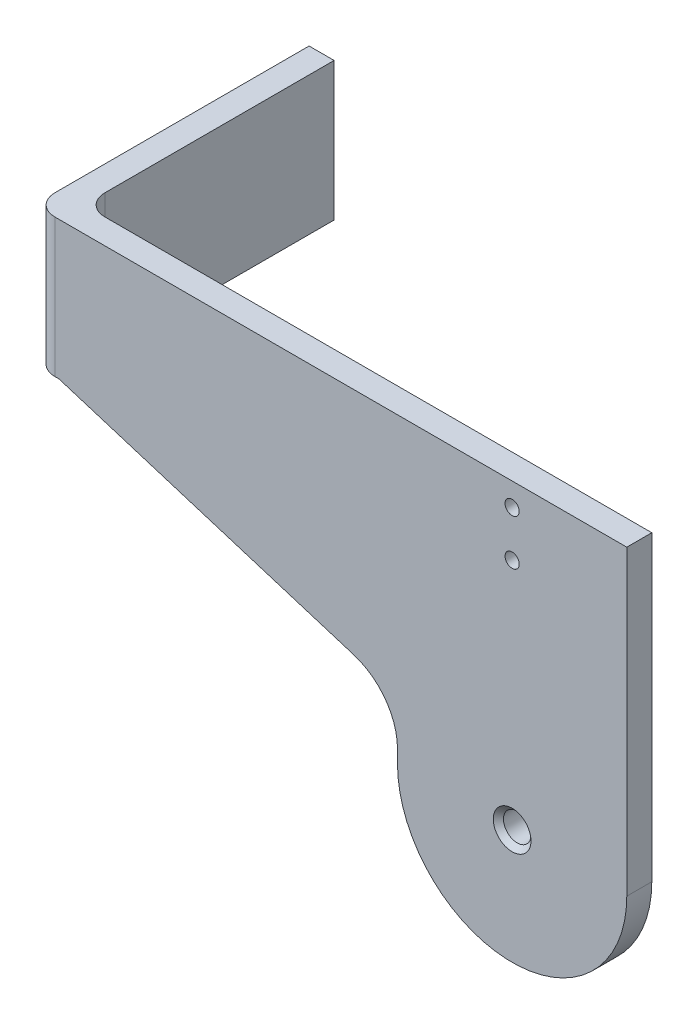
ISO-10303-21;
HEADER;
FILE_DESCRIPTION(('STEP AP214'),'2;1');
FILE_NAME('part.step','',(''),(''),'','','');
FILE_SCHEMA(('AUTOMOTIVE_DESIGN { 1 0 10303 214 1 1 1 1 }'));
ENDSEC;
DATA;
#1=APPLICATION_CONTEXT('core data for automotive mechanical design processes');
#2=APPLICATION_PROTOCOL_DEFINITION('international standard','automotive_design',2000,#1);
#3=PRODUCT_CONTEXT('',#1,'mechanical');
#4=PRODUCT('Part','Part','',(#3));
#5=PRODUCT_RELATED_PRODUCT_CATEGORY('part','',(#4));
#6=PRODUCT_DEFINITION_FORMATION('','',#4);
#7=PRODUCT_DEFINITION_CONTEXT('part definition',#1,'design');
#8=PRODUCT_DEFINITION('design','',#6,#7);
#9=PRODUCT_DEFINITION_SHAPE('','',#8);
#10=(LENGTH_UNIT() NAMED_UNIT(*) SI_UNIT(.MILLI.,.METRE.));
#11=(NAMED_UNIT(*) PLANE_ANGLE_UNIT() SI_UNIT($,.RADIAN.));
#12=(NAMED_UNIT(*) SI_UNIT($,.STERADIAN.) SOLID_ANGLE_UNIT());
#13=UNCERTAINTY_MEASURE_WITH_UNIT(LENGTH_MEASURE(1.E-05),#10,'distance_accuracy_value','');
#14=(GEOMETRIC_REPRESENTATION_CONTEXT(3) GLOBAL_UNCERTAINTY_ASSIGNED_CONTEXT((#13)) GLOBAL_UNIT_ASSIGNED_CONTEXT((#10,
#11,#12)) REPRESENTATION_CONTEXT('',''));
#15=CARTESIAN_POINT('',(0.,0.,0.));
#16=DIRECTION('',(0.,0.,1.));
#17=DIRECTION('',(1.,0.,0.));
#18=AXIS2_PLACEMENT_3D('',#15,#16,#17);
#19=CARTESIAN_POINT('',(-103.7,0.,-5.));
#20=DIRECTION('',(0.,-1.,0.));
#21=DIRECTION('',(0.,0.,-1.));
#22=AXIS2_PLACEMENT_3D('',#19,#20,#21);
#23=CYLINDRICAL_SURFACE('',#22,5.);
#24=DIRECTION('',(0.,1.,0.));
#25=VECTOR('',#24,1.);
#26=CARTESIAN_POINT('',(-103.7,0.,0.));
#27=LINE('',#26,#25);
#28=CARTESIAN_POINT('',(-103.7,37.7951910226967,0.));
#29=VERTEX_POINT('',#28);
#30=CARTESIAN_POINT('',(-103.7,72.5,0.));
#31=VERTEX_POINT('',#30);
#32=EDGE_CURVE('E217',#29,#31,#27,.T.);
#33=ORIENTED_EDGE('',*,*,#32,.F.);
#34=CARTESIAN_POINT('',(-103.7,37.7951910226967,-5.));
#35=DIRECTION('',(0.296450533397002,0.955048208861015,0.));
#36=DIRECTION('',(0.955048208861015,-0.296450533397003,0.));
#37=AXIS2_PLACEMENT_3D('',#34,#35,#36);
#38=ELLIPSE('',#37,5.2353378118608,5.);
#39=CARTESIAN_POINT('',(-108.7,39.3472097095363,-5.));
#40=VERTEX_POINT('',#39);
#41=EDGE_CURVE('E222',#29,#40,#38,.F.);
#42=ORIENTED_EDGE('',*,*,#41,.T.);
#43=DIRECTION('',(0.,1.,0.));
#44=VECTOR('',#43,1.);
#45=CARTESIAN_POINT('',(-108.7,0.,-5.));
#46=LINE('',#45,#44);
#47=CARTESIAN_POINT('',(-108.7,72.5,-5.));
#48=VERTEX_POINT('',#47);
#49=EDGE_CURVE('E220',#48,#40,#46,.F.);
#50=ORIENTED_EDGE('',*,*,#49,.F.);
#51=CARTESIAN_POINT('',(-103.7,72.5,-5.));
#52=DIRECTION('',(0.,-1.,0.));
#53=DIRECTION('',(1.,0.,0.));
#54=AXIS2_PLACEMENT_3D('',#51,#52,#53);
#55=CIRCLE('',#54,5.);
#56=EDGE_CURVE('E132',#48,#31,#55,.F.);
#57=ORIENTED_EDGE('',*,*,#56,.T.);
#58=EDGE_LOOP('',(#33,#42,#50,#57));
#59=FACE_BOUND('',#58,.T.);
#60=ADVANCED_FACE('F42',(#59),#23,.F.);
#61=CARTESIAN_POINT('',(-42.5,3.09246886019721,0.));
#62=DIRECTION('',(0.,0.,-1.));
#63=DIRECTION('',(-1.,0.,0.));
#64=AXIS2_PLACEMENT_3D('',#61,#62,#63);
#65=CYLINDRICAL_SURFACE('',#64,15.);
#66=DIRECTION('',(0.,0.,1.));
#67=VECTOR('',#66,1.);
#68=CARTESIAN_POINT('',(-38.053241999045,17.4181919931124,0.));
#69=LINE('',#68,#67);
#70=CARTESIAN_POINT('',(-38.053241999045,17.4181919931124,0.));
#71=VERTEX_POINT('',#70);
#72=CARTESIAN_POINT('',(-38.053241999045,17.4181919931124,6.));
#73=VERTEX_POINT('',#72);
#74=EDGE_CURVE('E207',#71,#73,#69,.T.);
#75=ORIENTED_EDGE('',*,*,#74,.F.);
#76=CARTESIAN_POINT('',(-42.5,3.09246886019721,0.));
#77=DIRECTION('',(0.,0.,1.));
#78=DIRECTION('',(1.,0.,0.));
#79=AXIS2_PLACEMENT_3D('',#76,#77,#78);
#80=CIRCLE('',#79,15.);
#81=CARTESIAN_POINT('',(-27.5,3.09246886019721,0.));
#82=VERTEX_POINT('',#81);
#83=EDGE_CURVE('E213',#71,#82,#80,.F.);
#84=ORIENTED_EDGE('',*,*,#83,.T.);
#85=DIRECTION('',(0.,0.,1.));
#86=VECTOR('',#85,1.);
#87=CARTESIAN_POINT('',(-27.5,3.09246886019721,0.));
#88=LINE('',#87,#86);
#89=CARTESIAN_POINT('',(-27.5,3.09246886019721,6.));
#90=VERTEX_POINT('',#89);
#91=EDGE_CURVE('E210',#90,#82,#88,.F.);
#92=ORIENTED_EDGE('',*,*,#91,.F.);
#93=CARTESIAN_POINT('',(-42.5,3.09246886019721,6.));
#94=DIRECTION('',(0.,0.,1.));
#95=DIRECTION('',(1.,0.,0.));
#96=AXIS2_PLACEMENT_3D('',#93,#94,#95);
#97=CIRCLE('',#96,15.);
#98=EDGE_CURVE('E215',#90,#73,#97,.T.);
#99=ORIENTED_EDGE('',*,*,#98,.T.);
#100=EDGE_LOOP('',(#75,#84,#92,#99));
#101=FACE_BOUND('',#100,.T.);
#102=ADVANCED_FACE('F250',(#101),#65,.F.);
#103=CARTESIAN_POINT('',(0.,0.,6.));
#104=DIRECTION('',(0.,0.,-1.));
#105=DIRECTION('',(-1.,0.,0.));
#106=AXIS2_PLACEMENT_3D('',#103,#104,#105);
#107=CYLINDRICAL_SURFACE('',#106,27.5);
#108=CARTESIAN_POINT('',(0.,0.,0.));
#109=DIRECTION('',(0.,0.,1.));
#110=DIRECTION('',(1.,0.,0.));
#111=AXIS2_PLACEMENT_3D('',#108,#109,#110);
#112=CIRCLE('',#111,27.5);
#113=CARTESIAN_POINT('',(-27.5,0.,0.));
#114=VERTEX_POINT('',#113);
#115=CARTESIAN_POINT('',(27.5,0.,0.));
#116=VERTEX_POINT('',#115);
#117=EDGE_CURVE('E190',#114,#116,#112,.T.);
#118=ORIENTED_EDGE('',*,*,#117,.T.);
#119=DIRECTION('',(0.,0.,-1.));
#120=VECTOR('',#119,1.);
#121=CARTESIAN_POINT('',(27.5,0.,6.));
#122=LINE('',#121,#120);
#123=CARTESIAN_POINT('',(27.5,0.,6.));
#124=VERTEX_POINT('',#123);
#125=EDGE_CURVE('E204',#124,#116,#122,.T.);
#126=ORIENTED_EDGE('',*,*,#125,.F.);
#127=CARTESIAN_POINT('',(0.,0.,6.));
#128=DIRECTION('',(0.,0.,1.));
#129=DIRECTION('',(1.,0.,0.));
#130=AXIS2_PLACEMENT_3D('',#127,#128,#129);
#131=CIRCLE('',#130,27.5);
#132=CARTESIAN_POINT('',(-27.5,0.,6.));
#133=VERTEX_POINT('',#132);
#134=EDGE_CURVE('E191',#133,#124,#131,.T.);
#135=ORIENTED_EDGE('',*,*,#134,.F.);
#136=DIRECTION('',(0.,0.,-1.));
#137=VECTOR('',#136,1.);
#138=CARTESIAN_POINT('',(-27.5,0.,6.));
#139=LINE('',#138,#137);
#140=EDGE_CURVE('E197',#133,#114,#139,.T.);
#141=ORIENTED_EDGE('',*,*,#140,.T.);
#142=EDGE_LOOP('',(#118,#126,#135,#141));
#143=FACE_BOUND('',#142,.T.);
#144=ADVANCED_FACE('F255',(#143),#107,.T.);
#145=CARTESIAN_POINT('',(27.5,0.,6.));
#146=DIRECTION('',(-1.,0.,0.));
#147=DIRECTION('',(0.,0.,1.));
#148=AXIS2_PLACEMENT_3D('',#145,#146,#147);
#149=PLANE('',#148);
#150=DIRECTION('',(0.,1.,0.));
#151=VECTOR('',#150,1.);
#152=CARTESIAN_POINT('',(27.5,0.,0.));
#153=LINE('',#152,#151);
#154=CARTESIAN_POINT('',(27.5,72.5,0.));
#155=VERTEX_POINT('',#154);
#156=EDGE_CURVE('E195',#116,#155,#153,.T.);
#157=ORIENTED_EDGE('',*,*,#156,.T.);
#158=DIRECTION('',(0.,0.,-1.));
#159=VECTOR('',#158,1.);
#160=CARTESIAN_POINT('',(27.5,72.5,6.));
#161=LINE('',#160,#159);
#162=CARTESIAN_POINT('',(27.5,72.5,6.));
#163=VERTEX_POINT('',#162);
#164=EDGE_CURVE('E186',#163,#155,#161,.T.);
#165=ORIENTED_EDGE('',*,*,#164,.F.);
#166=DIRECTION('',(0.,1.,0.));
#167=VECTOR('',#166,1.);
#168=CARTESIAN_POINT('',(27.5,0.,6.));
#169=LINE('',#168,#167);
#170=EDGE_CURVE('E194',#124,#163,#169,.T.);
#171=ORIENTED_EDGE('',*,*,#170,.F.);
#172=ORIENTED_EDGE('',*,*,#125,.T.);
#173=EDGE_LOOP('',(#157,#165,#171,#172));
#174=FACE_BOUND('',#173,.T.);
#175=ADVANCED_FACE('F259',(#174),#149,.F.);
#176=CARTESIAN_POINT('',(0.,0.,6.));
#177=DIRECTION('',(0.,0.,1.));
#178=DIRECTION('',(1.,0.,0.));
#179=AXIS2_PLACEMENT_3D('',#176,#177,#178);
#180=PLANE('',#179);
#181=CARTESIAN_POINT('',(0.,67.,6.));
#182=DIRECTION('',(0.,0.,-1.));
#183=DIRECTION('',(-1.,0.,0.));
#184=AXIS2_PLACEMENT_3D('',#181,#182,#183);
#185=CIRCLE('',#184,1.7);
#186=CARTESIAN_POINT('',(-1.7,67.,6.));
#187=VERTEX_POINT('',#186);
#188=EDGE_CURVE('E512',#187,#187,#185,.T.);
#189=ORIENTED_EDGE('',*,*,#188,.T.);
#190=EDGE_LOOP('',(#189));
#191=FACE_BOUND('',#190,.T.);
#192=CARTESIAN_POINT('',(0.,56.05,6.));
#193=DIRECTION('',(0.,0.,-1.));
#194=DIRECTION('',(-1.,0.,0.));
#195=AXIS2_PLACEMENT_3D('',#192,#193,#194);
#196=CIRCLE('',#195,1.7);
#197=CARTESIAN_POINT('',(-1.7,56.05,6.));
#198=VERTEX_POINT('',#197);
#199=EDGE_CURVE('E527',#198,#198,#196,.T.);
#200=ORIENTED_EDGE('',*,*,#199,.T.);
#201=EDGE_LOOP('',(#200));
#202=FACE_BOUND('',#201,.T.);
#203=CARTESIAN_POINT('',(0.,0.,6.));
#204=DIRECTION('',(0.,0.,1.));
#205=DIRECTION('',(1.,0.,0.));
#206=AXIS2_PLACEMENT_3D('',#203,#204,#205);
#207=CIRCLE('',#206,4.525);
#208=CARTESIAN_POINT('',(4.525,0.,6.));
#209=VERTEX_POINT('',#208);
#210=EDGE_CURVE('E529',#209,#209,#207,.T.);
#211=ORIENTED_EDGE('',*,*,#210,.F.);
#212=EDGE_LOOP('',(#211));
#213=FACE_BOUND('',#212,.T.);
#214=DIRECTION('',(-1.,0.,0.));
#215=VECTOR('',#214,1.);
#216=CARTESIAN_POINT('',(27.5,72.5,6.));
#217=LINE('',#216,#215);
#218=CARTESIAN_POINT('',(-109.7,72.5,6.));
#219=VERTEX_POINT('',#218);
#220=EDGE_CURVE('E183',#163,#219,#217,.T.);
#221=ORIENTED_EDGE('',*,*,#220,.T.);
#222=DIRECTION('',(0.,-1.,0.));
#223=VECTOR('',#222,1.);
#224=CARTESIAN_POINT('',(-109.7,39.3472097095363,6.));
#225=LINE('',#224,#223);
#226=CARTESIAN_POINT('',(-109.7,39.3472097095363,6.));
#227=VERTEX_POINT('',#226);
#228=EDGE_CURVE('E226',#219,#227,#225,.T.);
#229=ORIENTED_EDGE('',*,*,#228,.T.);
#230=DIRECTION('',(1.,0.,0.));
#231=VECTOR('',#230,1.);
#232=CARTESIAN_POINT('',(-108.7,39.3472097095363,6.));
#233=LINE('',#232,#231);
#234=CARTESIAN_POINT('',(-108.7,39.3472097095363,6.));
#235=VERTEX_POINT('',#234);
#236=EDGE_CURVE('E162',#227,#235,#233,.T.);
#237=ORIENTED_EDGE('',*,*,#236,.T.);
#238=DIRECTION('',(-0.955048208861015,0.296450533397002,0.));
#239=VECTOR('',#238,1.);
#240=CARTESIAN_POINT('',(-108.7,39.3472097095363,6.));
#241=LINE('',#240,#239);
#242=EDGE_CURVE('E137',#73,#235,#241,.T.);
#243=ORIENTED_EDGE('',*,*,#242,.F.);
#244=ORIENTED_EDGE('',*,*,#98,.F.);
#245=DIRECTION('',(0.,1.,0.));
#246=VECTOR('',#245,1.);
#247=CARTESIAN_POINT('',(-27.5,14.1424262352607,6.));
#248=LINE('',#247,#246);
#249=EDGE_CURVE('E172',#133,#90,#248,.T.);
#250=ORIENTED_EDGE('',*,*,#249,.F.);
#251=ORIENTED_EDGE('',*,*,#134,.T.);
#252=ORIENTED_EDGE('',*,*,#170,.T.);
#253=EDGE_LOOP('',(#221,#229,#237,#243,#244,#250,#251,#252));
#254=FACE_BOUND('',#253,.T.);
#255=ADVANCED_FACE('F232',(#191,#202,#213,#254),#180,.T.);
#256=CARTESIAN_POINT('',(0.,0.,0.));
#257=DIRECTION('',(0.,0.,1.));
#258=DIRECTION('',(1.,0.,0.));
#259=AXIS2_PLACEMENT_3D('',#256,#257,#258);
#260=PLANE('',#259);
#261=CARTESIAN_POINT('',(0.,67.,0.));
#262=DIRECTION('',(0.,0.,-1.));
#263=DIRECTION('',(-1.,0.,0.));
#264=AXIS2_PLACEMENT_3D('',#261,#262,#263);
#265=CIRCLE('',#264,4.525);
#266=CARTESIAN_POINT('',(-4.525,67.,0.));
#267=VERTEX_POINT('',#266);
#268=EDGE_CURVE('E502',#267,#267,#265,.T.);
#269=ORIENTED_EDGE('',*,*,#268,.F.);
#270=EDGE_LOOP('',(#269));
#271=FACE_BOUND('',#270,.T.);
#272=CARTESIAN_POINT('',(0.,56.05,0.));
#273=DIRECTION('',(0.,0.,-1.));
#274=DIRECTION('',(-1.,0.,0.));
#275=AXIS2_PLACEMENT_3D('',#272,#273,#274);
#276=CIRCLE('',#275,4.525);
#277=CARTESIAN_POINT('',(-4.525,56.05,0.));
#278=VERTEX_POINT('',#277);
#279=EDGE_CURVE('E515',#278,#278,#276,.T.);
#280=ORIENTED_EDGE('',*,*,#279,.F.);
#281=EDGE_LOOP('',(#280));
#282=FACE_BOUND('',#281,.T.);
#283=CARTESIAN_POINT('',(0.,0.,0.));
#284=DIRECTION('',(0.,0.,1.));
#285=DIRECTION('',(1.,0.,0.));
#286=AXIS2_PLACEMENT_3D('',#283,#284,#285);
#287=CIRCLE('',#286,3.3);
#288=CARTESIAN_POINT('',(3.3,0.,0.));
#289=VERTEX_POINT('',#288);
#290=EDGE_CURVE('E46',#289,#289,#287,.T.);
#291=ORIENTED_EDGE('',*,*,#290,.T.);
#292=EDGE_LOOP('',(#291));
#293=FACE_BOUND('',#292,.T.);
#294=DIRECTION('',(-0.955048208861015,0.296450533397002,0.));
#295=VECTOR('',#294,1.);
#296=CARTESIAN_POINT('',(-108.7,39.3472097095363,0.));
#297=LINE('',#296,#295);
#298=EDGE_CURVE('E168',#71,#29,#297,.T.);
#299=ORIENTED_EDGE('',*,*,#298,.T.);
#300=ORIENTED_EDGE('',*,*,#32,.T.);
#301=DIRECTION('',(-1.,0.,0.));
#302=VECTOR('',#301,1.);
#303=CARTESIAN_POINT('',(27.5,72.5,0.));
#304=LINE('',#303,#302);
#305=EDGE_CURVE('E182',#155,#31,#304,.T.);
#306=ORIENTED_EDGE('',*,*,#305,.F.);
#307=ORIENTED_EDGE('',*,*,#156,.F.);
#308=ORIENTED_EDGE('',*,*,#117,.F.);
#309=DIRECTION('',(0.,1.,0.));
#310=VECTOR('',#309,1.);
#311=CARTESIAN_POINT('',(-27.5,14.1424262352607,0.));
#312=LINE('',#311,#310);
#313=EDGE_CURVE('E171',#114,#82,#312,.T.);
#314=ORIENTED_EDGE('',*,*,#313,.T.);
#315=ORIENTED_EDGE('',*,*,#83,.F.);
#316=EDGE_LOOP('',(#299,#300,#306,#307,#308,#314,#315));
#317=FACE_BOUND('',#316,.T.);
#318=ADVANCED_FACE('F244',(#271,#282,#293,#317),#260,.F.);
#319=CARTESIAN_POINT('',(27.5,72.5,6.));
#320=DIRECTION('',(0.,-1.,0.));
#321=DIRECTION('',(1.,0.,0.));
#322=AXIS2_PLACEMENT_3D('',#319,#320,#321);
#323=PLANE('',#322);
#324=DIRECTION('',(0.,0.,-1.));
#325=VECTOR('',#324,1.);
#326=CARTESIAN_POINT('',(-114.7,72.5,6.));
#327=LINE('',#326,#325);
#328=CARTESIAN_POINT('',(-114.7,72.5,1.));
#329=VERTEX_POINT('',#328);
#330=CARTESIAN_POINT('',(-114.7,72.5,-60.));
#331=VERTEX_POINT('',#330);
#332=EDGE_CURVE('E138',#329,#331,#327,.T.);
#333=ORIENTED_EDGE('',*,*,#332,.F.);
#334=CARTESIAN_POINT('',(-109.7,72.5,1.));
#335=DIRECTION('',(0.,-1.,0.));
#336=DIRECTION('',(1.,0.,0.));
#337=AXIS2_PLACEMENT_3D('',#334,#335,#336);
#338=CIRCLE('',#337,5.);
#339=EDGE_CURVE('E11',#329,#219,#338,.F.);
#340=ORIENTED_EDGE('',*,*,#339,.T.);
#341=ORIENTED_EDGE('',*,*,#220,.F.);
#342=ORIENTED_EDGE('',*,*,#164,.T.);
#343=ORIENTED_EDGE('',*,*,#305,.T.);
#344=ORIENTED_EDGE('',*,*,#56,.F.);
#345=DIRECTION('',(0.,0.,-1.));
#346=VECTOR('',#345,1.);
#347=CARTESIAN_POINT('',(-108.7,72.5,6.));
#348=LINE('',#347,#346);
#349=CARTESIAN_POINT('',(-108.7,72.5,-60.));
#350=VERTEX_POINT('',#349);
#351=EDGE_CURVE('E127',#48,#350,#348,.T.);
#352=ORIENTED_EDGE('',*,*,#351,.T.);
#353=DIRECTION('',(-1.,0.,0.));
#354=VECTOR('',#353,1.);
#355=CARTESIAN_POINT('',(-114.7,72.5,-60.));
#356=LINE('',#355,#354);
#357=EDGE_CURVE('E130',#350,#331,#356,.T.);
#358=ORIENTED_EDGE('',*,*,#357,.T.);
#359=EDGE_LOOP('',(#333,#340,#341,#342,#343,#344,#352,#358));
#360=FACE_BOUND('',#359,.T.);
#361=ADVANCED_FACE('F129',(#360),#323,.F.);
#362=CARTESIAN_POINT('',(-108.7,39.3472097095363,0.));
#363=DIRECTION('',(0.296450533397002,0.955048208861015,0.));
#364=DIRECTION('',(-0.955048208861015,0.296450533397003,0.));
#365=AXIS2_PLACEMENT_3D('',#362,#363,#364);
#366=PLANE('',#365);
#367=ORIENTED_EDGE('',*,*,#298,.F.);
#368=ORIENTED_EDGE('',*,*,#74,.T.);
#369=ORIENTED_EDGE('',*,*,#242,.T.);
#370=DIRECTION('',(0.,0.,1.));
#371=VECTOR('',#370,1.);
#372=CARTESIAN_POINT('',(-108.7,39.3472097095363,0.));
#373=LINE('',#372,#371);
#374=EDGE_CURVE('E175',#40,#235,#373,.T.);
#375=ORIENTED_EDGE('',*,*,#374,.F.);
#376=ORIENTED_EDGE('',*,*,#41,.F.);
#377=EDGE_LOOP('',(#367,#368,#369,#375,#376));
#378=FACE_BOUND('',#377,.T.);
#379=ADVANCED_FACE('F240',(#378),#366,.F.);
#380=CARTESIAN_POINT('',(-27.5,14.1424262352607,0.));
#381=DIRECTION('',(1.,0.,0.));
#382=DIRECTION('',(0.,1.,0.));
#383=AXIS2_PLACEMENT_3D('',#380,#381,#382);
#384=PLANE('',#383);
#385=ORIENTED_EDGE('',*,*,#249,.T.);
#386=ORIENTED_EDGE('',*,*,#91,.T.);
#387=ORIENTED_EDGE('',*,*,#313,.F.);
#388=ORIENTED_EDGE('',*,*,#140,.F.);
#389=EDGE_LOOP('',(#385,#386,#387,#388));
#390=FACE_BOUND('',#389,.T.);
#391=ADVANCED_FACE('F252',(#390),#384,.F.);
#392=CARTESIAN_POINT('',(-108.7,72.5,6.));
#393=DIRECTION('',(-1.,0.,0.));
#394=DIRECTION('',(0.,0.,1.));
#395=AXIS2_PLACEMENT_3D('',#392,#393,#394);
#396=PLANE('',#395);
#397=ORIENTED_EDGE('',*,*,#351,.F.);
#398=ORIENTED_EDGE('',*,*,#49,.T.);
#399=DIRECTION('',(0.,0.,-1.));
#400=VECTOR('',#399,1.);
#401=CARTESIAN_POINT('',(-108.7,39.3472097095363,6.));
#402=LINE('',#401,#400);
#403=CARTESIAN_POINT('',(-108.7,39.3472097095363,-60.));
#404=VERTEX_POINT('',#403);
#405=EDGE_CURVE('E152',#40,#404,#402,.T.);
#406=ORIENTED_EDGE('',*,*,#405,.T.);
#407=DIRECTION('',(0.,1.,0.));
#408=VECTOR('',#407,1.);
#409=CARTESIAN_POINT('',(-108.7,72.5,-60.));
#410=LINE('',#409,#408);
#411=EDGE_CURVE('E145',#404,#350,#410,.T.);
#412=ORIENTED_EDGE('',*,*,#411,.T.);
#413=EDGE_LOOP('',(#397,#398,#406,#412));
#414=FACE_BOUND('',#413,.T.);
#415=ADVANCED_FACE('F150',(#414),#396,.F.);
#416=CARTESIAN_POINT('',(-114.7,39.3472097095363,6.));
#417=DIRECTION('',(1.,0.,0.));
#418=DIRECTION('',(0.,0.,-1.));
#419=AXIS2_PLACEMENT_3D('',#416,#417,#418);
#420=PLANE('',#419);
#421=DIRECTION('',(0.,0.,-1.));
#422=VECTOR('',#421,1.);
#423=CARTESIAN_POINT('',(-114.7,39.3472097095363,6.));
#424=LINE('',#423,#422);
#425=CARTESIAN_POINT('',(-114.7,39.3472097095363,1.));
#426=VERTEX_POINT('',#425);
#427=CARTESIAN_POINT('',(-114.7,39.3472097095363,-60.));
#428=VERTEX_POINT('',#427);
#429=EDGE_CURVE('E165',#426,#428,#424,.T.);
#430=ORIENTED_EDGE('',*,*,#429,.F.);
#431=DIRECTION('',(0.,-1.,0.));
#432=VECTOR('',#431,1.);
#433=CARTESIAN_POINT('',(-114.7,72.5,1.));
#434=LINE('',#433,#432);
#435=EDGE_CURVE('E51',#426,#329,#434,.F.);
#436=ORIENTED_EDGE('',*,*,#435,.T.);
#437=ORIENTED_EDGE('',*,*,#332,.T.);
#438=DIRECTION('',(0.,-1.,0.));
#439=VECTOR('',#438,1.);
#440=CARTESIAN_POINT('',(-114.7,39.3472097095363,-60.));
#441=LINE('',#440,#439);
#442=EDGE_CURVE('E148',#331,#428,#441,.T.);
#443=ORIENTED_EDGE('',*,*,#442,.T.);
#444=EDGE_LOOP('',(#430,#436,#437,#443));
#445=FACE_BOUND('',#444,.T.);
#446=ADVANCED_FACE('F475',(#445),#420,.F.);
#447=CARTESIAN_POINT('',(-108.7,39.3472097095363,6.));
#448=DIRECTION('',(0.,1.,0.));
#449=DIRECTION('',(0.,0.,1.));
#450=AXIS2_PLACEMENT_3D('',#447,#448,#449);
#451=PLANE('',#450);
#452=ORIENTED_EDGE('',*,*,#236,.F.);
#453=CARTESIAN_POINT('',(-109.7,39.3472097095363,1.));
#454=DIRECTION('',(0.,1.,0.));
#455=DIRECTION('',(0.,0.,1.));
#456=AXIS2_PLACEMENT_3D('',#453,#454,#455);
#457=CIRCLE('',#456,5.);
#458=EDGE_CURVE('E65',#227,#426,#457,.F.);
#459=ORIENTED_EDGE('',*,*,#458,.T.);
#460=ORIENTED_EDGE('',*,*,#429,.T.);
#461=DIRECTION('',(1.,0.,0.));
#462=VECTOR('',#461,1.);
#463=CARTESIAN_POINT('',(-108.7,39.3472097095363,-60.));
#464=LINE('',#463,#462);
#465=EDGE_CURVE('E160',#428,#404,#464,.T.);
#466=ORIENTED_EDGE('',*,*,#465,.T.);
#467=ORIENTED_EDGE('',*,*,#405,.F.);
#468=ORIENTED_EDGE('',*,*,#374,.T.);
#469=EDGE_LOOP('',(#452,#459,#460,#466,#467,#468));
#470=FACE_BOUND('',#469,.T.);
#471=ADVANCED_FACE('F237',(#470),#451,.F.);
#472=CARTESIAN_POINT('',(0.,0.,-60.));
#473=DIRECTION('',(0.,0.,-1.));
#474=DIRECTION('',(-1.,0.,0.));
#475=AXIS2_PLACEMENT_3D('',#472,#473,#474);
#476=PLANE('',#475);
#477=ORIENTED_EDGE('',*,*,#411,.F.);
#478=ORIENTED_EDGE('',*,*,#465,.F.);
#479=ORIENTED_EDGE('',*,*,#442,.F.);
#480=ORIENTED_EDGE('',*,*,#357,.F.);
#481=EDGE_LOOP('',(#477,#478,#479,#480));
#482=FACE_BOUND('',#481,.T.);
#483=ADVANCED_FACE('F143',(#482),#476,.T.);
#484=CARTESIAN_POINT('',(-109.7,0.,1.));
#485=DIRECTION('',(0.,1.,0.));
#486=DIRECTION('',(0.,0.,1.));
#487=AXIS2_PLACEMENT_3D('',#484,#485,#486);
#488=CYLINDRICAL_SURFACE('',#487,5.);
#489=ORIENTED_EDGE('',*,*,#339,.F.);
#490=ORIENTED_EDGE('',*,*,#435,.F.);
#491=ORIENTED_EDGE('',*,*,#458,.F.);
#492=ORIENTED_EDGE('',*,*,#228,.F.);
#493=EDGE_LOOP('',(#489,#490,#491,#492));
#494=FACE_BOUND('',#493,.T.);
#495=ADVANCED_FACE('F44',(#494),#488,.T.);
#496=CARTESIAN_POINT('',(0.,0.,6.));
#497=DIRECTION('',(0.,0.,1.));
#498=DIRECTION('',(1.,0.,0.));
#499=AXIS2_PLACEMENT_3D('',#496,#497,#498);
#500=CYLINDRICAL_SURFACE('',#499,3.3);
#501=CARTESIAN_POINT('',(0.,0.,4.775));
#502=DIRECTION('',(0.,0.,1.));
#503=DIRECTION('',(1.,0.,0.));
#504=AXIS2_PLACEMENT_3D('',#501,#502,#503);
#505=CIRCLE('',#504,3.3);
#506=CARTESIAN_POINT('',(3.3,0.,4.775));
#507=VERTEX_POINT('',#506);
#508=EDGE_CURVE('E155',#507,#507,#505,.T.);
#509=ORIENTED_EDGE('',*,*,#508,.T.);
#510=EDGE_LOOP('',(#509));
#511=FACE_BOUND('',#510,.T.);
#512=ORIENTED_EDGE('',*,*,#290,.F.);
#513=EDGE_LOOP('',(#512));
#514=FACE_BOUND('',#513,.T.);
#515=ADVANCED_FACE('F362',(#511,#514),#500,.F.);
#516=CARTESIAN_POINT('',(0.,0.,6.));
#517=DIRECTION('',(0.,0.,1.));
#518=DIRECTION('',(1.,0.,0.));
#519=AXIS2_PLACEMENT_3D('',#516,#517,#518);
#520=CONICAL_SURFACE('',#519,4.525,0.785398163397448);
#521=ORIENTED_EDGE('',*,*,#508,.F.);
#522=EDGE_LOOP('',(#521));
#523=FACE_BOUND('',#522,.T.);
#524=ORIENTED_EDGE('',*,*,#210,.T.);
#525=EDGE_LOOP('',(#524));
#526=FACE_BOUND('',#525,.T.);
#527=ADVANCED_FACE('F370',(#523,#526),#520,.F.);
#528=CARTESIAN_POINT('',(0.,56.05,0.));
#529=DIRECTION('',(0.,0.,-1.));
#530=DIRECTION('',(-1.,0.,0.));
#531=AXIS2_PLACEMENT_3D('',#528,#529,#530);
#532=CYLINDRICAL_SURFACE('',#531,1.7);
#533=ORIENTED_EDGE('',*,*,#199,.F.);
#534=EDGE_LOOP('',(#533));
#535=FACE_BOUND('',#534,.T.);
#536=CARTESIAN_POINT('',(0.,56.05,0.5));
#537=DIRECTION('',(0.,0.,-1.));
#538=DIRECTION('',(-1.,0.,0.));
#539=AXIS2_PLACEMENT_3D('',#536,#537,#538);
#540=CIRCLE('',#539,1.7);
#541=CARTESIAN_POINT('',(-1.7,56.05,0.5));
#542=VERTEX_POINT('',#541);
#543=EDGE_CURVE('E524',#542,#542,#540,.T.);
#544=ORIENTED_EDGE('',*,*,#543,.T.);
#545=EDGE_LOOP('',(#544));
#546=FACE_BOUND('',#545,.T.);
#547=ADVANCED_FACE('F380',(#535,#546),#532,.F.);
#548=CARTESIAN_POINT('',(4.5,56.05,0.5));
#549=DIRECTION('',(0.,0.,1.));
#550=DIRECTION('',(1.,0.,0.));
#551=AXIS2_PLACEMENT_3D('',#548,#549,#550);
#552=PLANE('',#551);
#553=ORIENTED_EDGE('',*,*,#543,.F.);
#554=EDGE_LOOP('',(#553));
#555=FACE_BOUND('',#554,.T.);
#556=CARTESIAN_POINT('',(0.,56.05,0.5));
#557=DIRECTION('',(0.,0.,-1.));
#558=DIRECTION('',(-1.,0.,0.));
#559=AXIS2_PLACEMENT_3D('',#556,#557,#558);
#560=CIRCLE('',#559,4.5);
#561=CARTESIAN_POINT('',(-4.5,56.05,0.5));
#562=VERTEX_POINT('',#561);
#563=EDGE_CURVE('E521',#562,#562,#560,.T.);
#564=ORIENTED_EDGE('',*,*,#563,.T.);
#565=EDGE_LOOP('',(#564));
#566=FACE_BOUND('',#565,.T.);
#567=ADVANCED_FACE('F389',(#555,#566),#552,.F.);
#568=CARTESIAN_POINT('',(0.,56.05,0.));
#569=DIRECTION('',(0.,0.,-1.));
#570=DIRECTION('',(-1.,0.,0.));
#571=AXIS2_PLACEMENT_3D('',#568,#569,#570);
#572=CYLINDRICAL_SURFACE('',#571,4.5);
#573=ORIENTED_EDGE('',*,*,#563,.F.);
#574=EDGE_LOOP('',(#573));
#575=FACE_BOUND('',#574,.T.);
#576=CARTESIAN_POINT('',(0.,56.05,0.025));
#577=DIRECTION('',(0.,0.,-1.));
#578=DIRECTION('',(-1.,0.,0.));
#579=AXIS2_PLACEMENT_3D('',#576,#577,#578);
#580=CIRCLE('',#579,4.5);
#581=CARTESIAN_POINT('',(-4.5,56.05,0.025));
#582=VERTEX_POINT('',#581);
#583=EDGE_CURVE('E518',#582,#582,#580,.T.);
#584=ORIENTED_EDGE('',*,*,#583,.T.);
#585=EDGE_LOOP('',(#584));
#586=FACE_BOUND('',#585,.T.);
#587=ADVANCED_FACE('F398',(#575,#586),#572,.F.);
#588=CARTESIAN_POINT('',(0.,56.05,0.));
#589=DIRECTION('',(0.,0.,-1.));
#590=DIRECTION('',(-1.,0.,0.));
#591=AXIS2_PLACEMENT_3D('',#588,#589,#590);
#592=CONICAL_SURFACE('',#591,4.525,0.785398163397411);
#593=ORIENTED_EDGE('',*,*,#583,.F.);
#594=EDGE_LOOP('',(#593));
#595=FACE_BOUND('',#594,.T.);
#596=ORIENTED_EDGE('',*,*,#279,.T.);
#597=EDGE_LOOP('',(#596));
#598=FACE_BOUND('',#597,.T.);
#599=ADVANCED_FACE('F407',(#595,#598),#592,.F.);
#600=CARTESIAN_POINT('',(0.,67.,0.));
#601=DIRECTION('',(0.,0.,-1.));
#602=DIRECTION('',(-1.,0.,0.));
#603=AXIS2_PLACEMENT_3D('',#600,#601,#602);
#604=CYLINDRICAL_SURFACE('',#603,1.7);
#605=ORIENTED_EDGE('',*,*,#188,.F.);
#606=EDGE_LOOP('',(#605));
#607=FACE_BOUND('',#606,.T.);
#608=CARTESIAN_POINT('',(0.,67.,0.5));
#609=DIRECTION('',(0.,0.,-1.));
#610=DIRECTION('',(-1.,0.,0.));
#611=AXIS2_PLACEMENT_3D('',#608,#609,#610);
#612=CIRCLE('',#611,1.7);
#613=CARTESIAN_POINT('',(-1.7,67.,0.5));
#614=VERTEX_POINT('',#613);
#615=EDGE_CURVE('E509',#614,#614,#612,.T.);
#616=ORIENTED_EDGE('',*,*,#615,.T.);
#617=EDGE_LOOP('',(#616));
#618=FACE_BOUND('',#617,.T.);
#619=ADVANCED_FACE('F416',(#607,#618),#604,.F.);
#620=CARTESIAN_POINT('',(4.5,67.,0.5));
#621=DIRECTION('',(0.,0.,1.));
#622=DIRECTION('',(1.,0.,0.));
#623=AXIS2_PLACEMENT_3D('',#620,#621,#622);
#624=PLANE('',#623);
#625=ORIENTED_EDGE('',*,*,#615,.F.);
#626=EDGE_LOOP('',(#625));
#627=FACE_BOUND('',#626,.T.);
#628=CARTESIAN_POINT('',(0.,67.,0.5));
#629=DIRECTION('',(0.,0.,-1.));
#630=DIRECTION('',(-1.,0.,0.));
#631=AXIS2_PLACEMENT_3D('',#628,#629,#630);
#632=CIRCLE('',#631,4.5);
#633=CARTESIAN_POINT('',(-4.5,67.,0.5));
#634=VERTEX_POINT('',#633);
#635=EDGE_CURVE('E504',#634,#634,#632,.T.);
#636=ORIENTED_EDGE('',*,*,#635,.T.);
#637=EDGE_LOOP('',(#636));
#638=FACE_BOUND('',#637,.T.);
#639=ADVANCED_FACE('F425',(#627,#638),#624,.F.);
#640=CARTESIAN_POINT('',(0.,67.,0.));
#641=DIRECTION('',(0.,0.,-1.));
#642=DIRECTION('',(-1.,0.,0.));
#643=AXIS2_PLACEMENT_3D('',#640,#641,#642);
#644=CYLINDRICAL_SURFACE('',#643,4.5);
#645=ORIENTED_EDGE('',*,*,#635,.F.);
#646=EDGE_LOOP('',(#645));
#647=FACE_BOUND('',#646,.T.);
#648=CARTESIAN_POINT('',(0.,67.,0.025));
#649=DIRECTION('',(0.,0.,-1.));
#650=DIRECTION('',(-1.,0.,0.));
#651=AXIS2_PLACEMENT_3D('',#648,#649,#650);
#652=CIRCLE('',#651,4.5);
#653=CARTESIAN_POINT('',(-4.5,67.,0.025));
#654=VERTEX_POINT('',#653);
#655=EDGE_CURVE('E499',#654,#654,#652,.T.);
#656=ORIENTED_EDGE('',*,*,#655,.T.);
#657=EDGE_LOOP('',(#656));
#658=FACE_BOUND('',#657,.T.);
#659=ADVANCED_FACE('F434',(#647,#658),#644,.F.);
#660=CARTESIAN_POINT('',(0.,67.,0.));
#661=DIRECTION('',(0.,0.,-1.));
#662=DIRECTION('',(-1.,0.,0.));
#663=AXIS2_PLACEMENT_3D('',#660,#661,#662);
#664=CONICAL_SURFACE('',#663,4.525,0.785398163397411);
#665=ORIENTED_EDGE('',*,*,#655,.F.);
#666=EDGE_LOOP('',(#665));
#667=FACE_BOUND('',#666,.T.);
#668=ORIENTED_EDGE('',*,*,#268,.T.);
#669=EDGE_LOOP('',(#668));
#670=FACE_BOUND('',#669,.T.);
#671=ADVANCED_FACE('F443',(#667,#670),#664,.F.);
#672=CLOSED_SHELL('',(#60,#102,#144,#175,#255,#318,#361,#379,#391,#415,#446,#471,#483,#495,#515,
#527,#547,#567,#587,#599,#619,#639,#659,#671));
#673=MANIFOLD_SOLID_BREP('B2',#672);
#674=ADVANCED_BREP_SHAPE_REPRESENTATION('',(#18,#673),#14);
#675=SHAPE_DEFINITION_REPRESENTATION(#9,#674);
ENDSEC;
END-ISO-10303-21;
